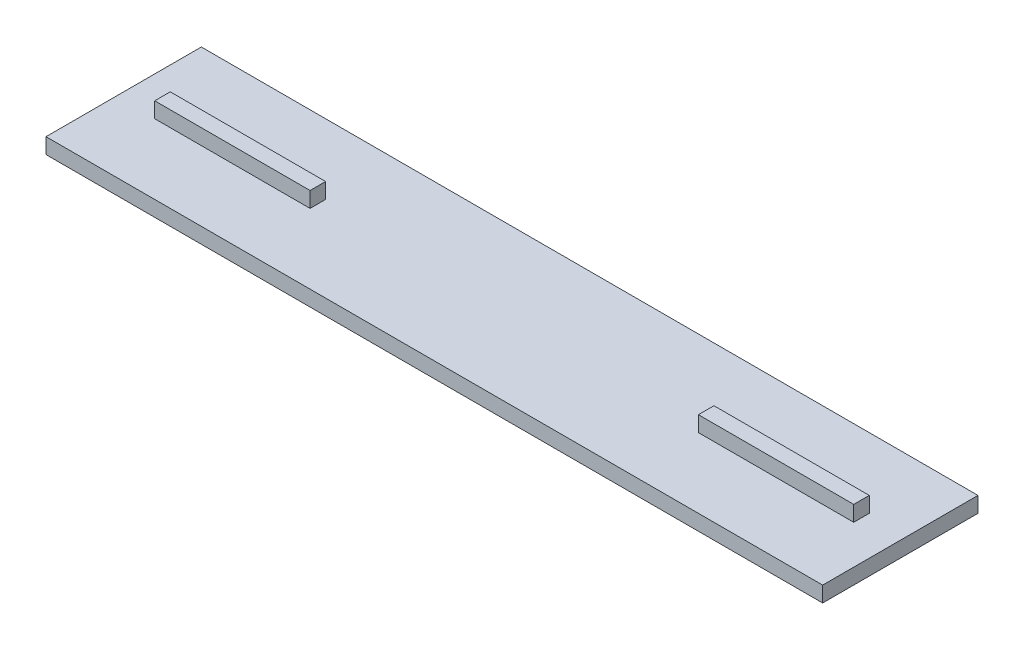
ISO-10303-21;
HEADER;
FILE_DESCRIPTION(('STEP AP214'),'2;1');
FILE_NAME('part.step','',(''),(''),'','','');
FILE_SCHEMA(('AUTOMOTIVE_DESIGN { 1 0 10303 214 1 1 1 1 }'));
ENDSEC;
DATA;
#1=APPLICATION_CONTEXT('core data for automotive mechanical design processes');
#2=APPLICATION_PROTOCOL_DEFINITION('international standard','automotive_design',2000,#1);
#3=PRODUCT_CONTEXT('',#1,'mechanical');
#4=PRODUCT('Part','Part','',(#3));
#5=PRODUCT_RELATED_PRODUCT_CATEGORY('part','',(#4));
#6=PRODUCT_DEFINITION_FORMATION('','',#4);
#7=PRODUCT_DEFINITION_CONTEXT('part definition',#1,'design');
#8=PRODUCT_DEFINITION('design','',#6,#7);
#9=PRODUCT_DEFINITION_SHAPE('','',#8);
#10=(LENGTH_UNIT() NAMED_UNIT(*) SI_UNIT(.MILLI.,.METRE.));
#11=(NAMED_UNIT(*) PLANE_ANGLE_UNIT() SI_UNIT($,.RADIAN.));
#12=(NAMED_UNIT(*) SI_UNIT($,.STERADIAN.) SOLID_ANGLE_UNIT());
#13=UNCERTAINTY_MEASURE_WITH_UNIT(LENGTH_MEASURE(1.E-05),#10,'distance_accuracy_value','');
#14=(GEOMETRIC_REPRESENTATION_CONTEXT(3) GLOBAL_UNCERTAINTY_ASSIGNED_CONTEXT((#13)) GLOBAL_UNIT_ASSIGNED_CONTEXT((#10,
#11,#12)) REPRESENTATION_CONTEXT('',''));
#15=CARTESIAN_POINT('',(0.,0.,0.));
#16=DIRECTION('',(0.,0.,1.));
#17=DIRECTION('',(1.,0.,0.));
#18=AXIS2_PLACEMENT_3D('',#15,#16,#17);
#19=CARTESIAN_POINT('',(0.,2.,0.));
#20=DIRECTION('',(0.,1.,0.));
#21=DIRECTION('',(0.,0.,1.));
#22=AXIS2_PLACEMENT_3D('',#19,#20,#21);
#23=PLANE('',#22);
#24=DIRECTION('',(0.,0.,1.));
#25=VECTOR('',#24,1.);
#26=CARTESIAN_POINT('',(-50.,2.,0.));
#27=LINE('',#26,#25);
#28=CARTESIAN_POINT('',(-50.,2.,0.));
#29=VERTEX_POINT('',#28);
#30=CARTESIAN_POINT('',(-50.,2.,20.));
#31=VERTEX_POINT('',#30);
#32=EDGE_CURVE('E232',#29,#31,#27,.T.);
#33=ORIENTED_EDGE('',*,*,#32,.T.);
#34=DIRECTION('',(1.,0.,0.));
#35=VECTOR('',#34,1.);
#36=CARTESIAN_POINT('',(-50.,2.,20.));
#37=LINE('',#36,#35);
#38=CARTESIAN_POINT('',(50.,2.,20.));
#39=VERTEX_POINT('',#38);
#40=EDGE_CURVE('E236',#31,#39,#37,.T.);
#41=ORIENTED_EDGE('',*,*,#40,.T.);
#42=DIRECTION('',(0.,0.,-1.));
#43=VECTOR('',#42,1.);
#44=CARTESIAN_POINT('',(50.,2.,0.));
#45=LINE('',#44,#43);
#46=CARTESIAN_POINT('',(50.,2.,0.));
#47=VERTEX_POINT('',#46);
#48=EDGE_CURVE('E240',#39,#47,#45,.T.);
#49=ORIENTED_EDGE('',*,*,#48,.T.);
#50=DIRECTION('',(-1.,0.,0.));
#51=VECTOR('',#50,1.);
#52=CARTESIAN_POINT('',(50.,2.,0.));
#53=LINE('',#52,#51);
#54=EDGE_CURVE('E243',#47,#29,#53,.T.);
#55=ORIENTED_EDGE('',*,*,#54,.T.);
#56=EDGE_LOOP('',(#33,#41,#49,#55));
#57=FACE_BOUND('',#56,.T.);
#58=DIRECTION('',(1.,0.,0.));
#59=VECTOR('',#58,1.);
#60=CARTESIAN_POINT('',(0.,2.,9.00000000000001));
#61=LINE('',#60,#59);
#62=CARTESIAN_POINT('',(25.,2.,9.00000000000001));
#63=VERTEX_POINT('',#62);
#64=CARTESIAN_POINT('',(45.,2.,9.00000000000001));
#65=VERTEX_POINT('',#64);
#66=EDGE_CURVE('E210',#63,#65,#61,.T.);
#67=ORIENTED_EDGE('',*,*,#66,.T.);
#68=DIRECTION('',(0.,0.,1.));
#69=VECTOR('',#68,1.);
#70=CARTESIAN_POINT('',(45.,2.,0.));
#71=LINE('',#70,#69);
#72=CARTESIAN_POINT('',(45.,2.,11.));
#73=VERTEX_POINT('',#72);
#74=EDGE_CURVE('E214',#65,#73,#71,.T.);
#75=ORIENTED_EDGE('',*,*,#74,.T.);
#76=DIRECTION('',(-1.,0.,0.));
#77=VECTOR('',#76,1.);
#78=CARTESIAN_POINT('',(0.,2.,11.));
#79=LINE('',#78,#77);
#80=CARTESIAN_POINT('',(25.,2.,11.));
#81=VERTEX_POINT('',#80);
#82=EDGE_CURVE('E157',#73,#81,#79,.T.);
#83=ORIENTED_EDGE('',*,*,#82,.T.);
#84=DIRECTION('',(0.,0.,-1.));
#85=VECTOR('',#84,1.);
#86=CARTESIAN_POINT('',(25.,2.,0.));
#87=LINE('',#86,#85);
#88=EDGE_CURVE('E206',#81,#63,#87,.T.);
#89=ORIENTED_EDGE('',*,*,#88,.T.);
#90=EDGE_LOOP('',(#67,#75,#83,#89));
#91=FACE_BOUND('',#90,.T.);
#92=DIRECTION('',(-1.,0.,0.));
#93=VECTOR('',#92,1.);
#94=CARTESIAN_POINT('',(0.,2.,11.));
#95=LINE('',#94,#93);
#96=CARTESIAN_POINT('',(-25.,2.,11.));
#97=VERTEX_POINT('',#96);
#98=CARTESIAN_POINT('',(-45.,2.,11.));
#99=VERTEX_POINT('',#98);
#100=EDGE_CURVE('E226',#97,#99,#95,.T.);
#101=ORIENTED_EDGE('',*,*,#100,.T.);
#102=DIRECTION('',(0.,0.,-1.));
#103=VECTOR('',#102,1.);
#104=CARTESIAN_POINT('',(-45.,2.,0.));
#105=LINE('',#104,#103);
#106=CARTESIAN_POINT('',(-45.,2.,9.00000000000001));
#107=VERTEX_POINT('',#106);
#108=EDGE_CURVE('E153',#99,#107,#105,.T.);
#109=ORIENTED_EDGE('',*,*,#108,.T.);
#110=DIRECTION('',(1.,0.,0.));
#111=VECTOR('',#110,1.);
#112=CARTESIAN_POINT('',(0.,2.,9.00000000000001));
#113=LINE('',#112,#111);
#114=CARTESIAN_POINT('',(-25.,2.,9.00000000000001));
#115=VERTEX_POINT('',#114);
#116=EDGE_CURVE('E218',#107,#115,#113,.T.);
#117=ORIENTED_EDGE('',*,*,#116,.T.);
#118=DIRECTION('',(0.,0.,1.));
#119=VECTOR('',#118,1.);
#120=CARTESIAN_POINT('',(-25.,2.,0.));
#121=LINE('',#120,#119);
#122=EDGE_CURVE('E222',#115,#97,#121,.T.);
#123=ORIENTED_EDGE('',*,*,#122,.T.);
#124=EDGE_LOOP('',(#101,#109,#117,#123));
#125=FACE_BOUND('',#124,.T.);
#126=ADVANCED_FACE('F45',(#57,#91,#125),#23,.T.);
#127=CARTESIAN_POINT('',(-50.,2.,0.));
#128=DIRECTION('',(1.,0.,0.));
#129=DIRECTION('',(0.,0.,-1.));
#130=AXIS2_PLACEMENT_3D('',#127,#128,#129);
#131=PLANE('',#130);
#132=DIRECTION('',(0.,0.,1.));
#133=VECTOR('',#132,1.);
#134=CARTESIAN_POINT('',(-50.,0.,0.));
#135=LINE('',#134,#133);
#136=CARTESIAN_POINT('',(-50.,0.,0.));
#137=VERTEX_POINT('',#136);
#138=CARTESIAN_POINT('',(-50.,0.,20.));
#139=VERTEX_POINT('',#138);
#140=EDGE_CURVE('E231',#137,#139,#135,.T.);
#141=ORIENTED_EDGE('',*,*,#140,.T.);
#142=DIRECTION('',(0.,-1.,0.));
#143=VECTOR('',#142,1.);
#144=CARTESIAN_POINT('',(-50.,2.,20.));
#145=LINE('',#144,#143);
#146=EDGE_CURVE('E11',#31,#139,#145,.T.);
#147=ORIENTED_EDGE('',*,*,#146,.F.);
#148=ORIENTED_EDGE('',*,*,#32,.F.);
#149=DIRECTION('',(0.,-1.,0.));
#150=VECTOR('',#149,1.);
#151=CARTESIAN_POINT('',(-50.,2.,0.));
#152=LINE('',#151,#150);
#153=EDGE_CURVE('E246',#29,#137,#152,.T.);
#154=ORIENTED_EDGE('',*,*,#153,.T.);
#155=EDGE_LOOP('',(#141,#147,#148,#154));
#156=FACE_BOUND('',#155,.T.);
#157=ADVANCED_FACE('F47',(#156),#131,.F.);
#158=CARTESIAN_POINT('',(-50.,2.,20.));
#159=DIRECTION('',(0.,0.,-1.));
#160=DIRECTION('',(-1.,0.,0.));
#161=AXIS2_PLACEMENT_3D('',#158,#159,#160);
#162=PLANE('',#161);
#163=DIRECTION('',(1.,0.,0.));
#164=VECTOR('',#163,1.);
#165=CARTESIAN_POINT('',(-50.,0.,20.));
#166=LINE('',#165,#164);
#167=CARTESIAN_POINT('',(50.,0.,20.));
#168=VERTEX_POINT('',#167);
#169=EDGE_CURVE('E250',#139,#168,#166,.T.);
#170=ORIENTED_EDGE('',*,*,#169,.T.);
#171=DIRECTION('',(0.,-1.,0.));
#172=VECTOR('',#171,1.);
#173=CARTESIAN_POINT('',(50.,2.,20.));
#174=LINE('',#173,#172);
#175=EDGE_CURVE('E54',#39,#168,#174,.T.);
#176=ORIENTED_EDGE('',*,*,#175,.F.);
#177=ORIENTED_EDGE('',*,*,#40,.F.);
#178=ORIENTED_EDGE('',*,*,#146,.T.);
#179=EDGE_LOOP('',(#170,#176,#177,#178));
#180=FACE_BOUND('',#179,.T.);
#181=ADVANCED_FACE('F286',(#180),#162,.F.);
#182=CARTESIAN_POINT('',(50.,2.,0.));
#183=DIRECTION('',(-1.,0.,0.));
#184=DIRECTION('',(0.,0.,1.));
#185=AXIS2_PLACEMENT_3D('',#182,#183,#184);
#186=PLANE('',#185);
#187=DIRECTION('',(0.,0.,-1.));
#188=VECTOR('',#187,1.);
#189=CARTESIAN_POINT('',(50.,0.,0.));
#190=LINE('',#189,#188);
#191=CARTESIAN_POINT('',(50.,0.,0.));
#192=VERTEX_POINT('',#191);
#193=EDGE_CURVE('E253',#168,#192,#190,.T.);
#194=ORIENTED_EDGE('',*,*,#193,.T.);
#195=DIRECTION('',(0.,-1.,0.));
#196=VECTOR('',#195,1.);
#197=CARTESIAN_POINT('',(50.,2.,0.));
#198=LINE('',#197,#196);
#199=EDGE_CURVE('E261',#47,#192,#198,.T.);
#200=ORIENTED_EDGE('',*,*,#199,.F.);
#201=ORIENTED_EDGE('',*,*,#48,.F.);
#202=ORIENTED_EDGE('',*,*,#175,.T.);
#203=EDGE_LOOP('',(#194,#200,#201,#202));
#204=FACE_BOUND('',#203,.T.);
#205=ADVANCED_FACE('F270',(#204),#186,.F.);
#206=CARTESIAN_POINT('',(50.,2.,0.));
#207=DIRECTION('',(0.,0.,1.));
#208=DIRECTION('',(1.,0.,0.));
#209=AXIS2_PLACEMENT_3D('',#206,#207,#208);
#210=PLANE('',#209);
#211=DIRECTION('',(-1.,0.,0.));
#212=VECTOR('',#211,1.);
#213=CARTESIAN_POINT('',(50.,0.,0.));
#214=LINE('',#213,#212);
#215=EDGE_CURVE('E237',#192,#137,#214,.T.);
#216=ORIENTED_EDGE('',*,*,#215,.T.);
#217=ORIENTED_EDGE('',*,*,#153,.F.);
#218=ORIENTED_EDGE('',*,*,#54,.F.);
#219=ORIENTED_EDGE('',*,*,#199,.T.);
#220=EDGE_LOOP('',(#216,#217,#218,#219));
#221=FACE_BOUND('',#220,.T.);
#222=ADVANCED_FACE('F279',(#221),#210,.F.);
#223=CARTESIAN_POINT('',(0.,0.,0.));
#224=DIRECTION('',(0.,1.,0.));
#225=DIRECTION('',(0.,0.,1.));
#226=AXIS2_PLACEMENT_3D('',#223,#224,#225);
#227=PLANE('',#226);
#228=ORIENTED_EDGE('',*,*,#140,.F.);
#229=ORIENTED_EDGE('',*,*,#215,.F.);
#230=ORIENTED_EDGE('',*,*,#193,.F.);
#231=ORIENTED_EDGE('',*,*,#169,.F.);
#232=EDGE_LOOP('',(#228,#229,#230,#231));
#233=FACE_BOUND('',#232,.T.);
#234=ADVANCED_FACE('F276',(#233),#227,.F.);
#235=CARTESIAN_POINT('',(45.,4.,10.));
#236=DIRECTION('',(-1.,0.,0.));
#237=DIRECTION('',(0.,0.,1.));
#238=AXIS2_PLACEMENT_3D('',#235,#236,#237);
#239=PLANE('',#238);
#240=ORIENTED_EDGE('',*,*,#74,.F.);
#241=DIRECTION('',(0.,-1.,0.));
#242=VECTOR('',#241,1.);
#243=CARTESIAN_POINT('',(45.,4.,9.00000000000001));
#244=LINE('',#243,#242);
#245=CARTESIAN_POINT('',(45.,4.,9.00000000000001));
#246=VERTEX_POINT('',#245);
#247=EDGE_CURVE('E178',#246,#65,#244,.T.);
#248=ORIENTED_EDGE('',*,*,#247,.F.);
#249=DIRECTION('',(0.,0.,-1.));
#250=VECTOR('',#249,1.);
#251=CARTESIAN_POINT('',(45.,4.,10.));
#252=LINE('',#251,#250);
#253=CARTESIAN_POINT('',(45.,4.,11.));
#254=VERTEX_POINT('',#253);
#255=EDGE_CURVE('E147',#254,#246,#252,.T.);
#256=ORIENTED_EDGE('',*,*,#255,.F.);
#257=DIRECTION('',(0.,-1.,0.));
#258=VECTOR('',#257,1.);
#259=CARTESIAN_POINT('',(45.,4.,11.));
#260=LINE('',#259,#258);
#261=EDGE_CURVE('E188',#254,#73,#260,.T.);
#262=ORIENTED_EDGE('',*,*,#261,.T.);
#263=EDGE_LOOP('',(#240,#248,#256,#262));
#264=FACE_BOUND('',#263,.T.);
#265=ADVANCED_FACE('F304',(#264),#239,.F.);
#266=CARTESIAN_POINT('',(45.,4.,9.00000000000001));
#267=DIRECTION('',(0.,0.,1.));
#268=DIRECTION('',(1.,0.,0.));
#269=AXIS2_PLACEMENT_3D('',#266,#267,#268);
#270=PLANE('',#269);
#271=ORIENTED_EDGE('',*,*,#66,.F.);
#272=DIRECTION('',(0.,-1.,0.));
#273=VECTOR('',#272,1.);
#274=CARTESIAN_POINT('',(25.,4.,9.00000000000001));
#275=LINE('',#274,#273);
#276=CARTESIAN_POINT('',(25.,4.,9.00000000000001));
#277=VERTEX_POINT('',#276);
#278=EDGE_CURVE('E182',#277,#63,#275,.T.);
#279=ORIENTED_EDGE('',*,*,#278,.F.);
#280=DIRECTION('',(-1.,0.,0.));
#281=VECTOR('',#280,1.);
#282=CARTESIAN_POINT('',(45.,4.,9.00000000000001));
#283=LINE('',#282,#281);
#284=EDGE_CURVE('E198',#246,#277,#283,.T.);
#285=ORIENTED_EDGE('',*,*,#284,.F.);
#286=ORIENTED_EDGE('',*,*,#247,.T.);
#287=EDGE_LOOP('',(#271,#279,#285,#286));
#288=FACE_BOUND('',#287,.T.);
#289=ADVANCED_FACE('F341',(#288),#270,.F.);
#290=CARTESIAN_POINT('',(25.,4.,9.00000000000001));
#291=DIRECTION('',(1.,0.,0.));
#292=DIRECTION('',(0.,0.,-1.));
#293=AXIS2_PLACEMENT_3D('',#290,#291,#292);
#294=PLANE('',#293);
#295=ORIENTED_EDGE('',*,*,#88,.F.);
#296=DIRECTION('',(0.,-1.,0.));
#297=VECTOR('',#296,1.);
#298=CARTESIAN_POINT('',(25.,4.,11.));
#299=LINE('',#298,#297);
#300=CARTESIAN_POINT('',(25.,4.,11.));
#301=VERTEX_POINT('',#300);
#302=EDGE_CURVE('E69',#301,#81,#299,.T.);
#303=ORIENTED_EDGE('',*,*,#302,.F.);
#304=DIRECTION('',(0.,0.,1.));
#305=VECTOR('',#304,1.);
#306=CARTESIAN_POINT('',(25.,4.,9.00000000000001));
#307=LINE('',#306,#305);
#308=EDGE_CURVE('E195',#277,#301,#307,.T.);
#309=ORIENTED_EDGE('',*,*,#308,.F.);
#310=ORIENTED_EDGE('',*,*,#278,.T.);
#311=EDGE_LOOP('',(#295,#303,#309,#310));
#312=FACE_BOUND('',#311,.T.);
#313=ADVANCED_FACE('F351',(#312),#294,.F.);
#314=CARTESIAN_POINT('',(45.,4.,11.));
#315=DIRECTION('',(0.,0.,-1.));
#316=DIRECTION('',(-1.,0.,0.));
#317=AXIS2_PLACEMENT_3D('',#314,#315,#316);
#318=PLANE('',#317);
#319=ORIENTED_EDGE('',*,*,#82,.F.);
#320=ORIENTED_EDGE('',*,*,#261,.F.);
#321=DIRECTION('',(1.,0.,0.));
#322=VECTOR('',#321,1.);
#323=CARTESIAN_POINT('',(45.,4.,11.));
#324=LINE('',#323,#322);
#325=EDGE_CURVE('E192',#301,#254,#324,.T.);
#326=ORIENTED_EDGE('',*,*,#325,.F.);
#327=ORIENTED_EDGE('',*,*,#302,.T.);
#328=EDGE_LOOP('',(#319,#320,#326,#327));
#329=FACE_BOUND('',#328,.T.);
#330=ADVANCED_FACE('F360',(#329),#318,.F.);
#331=CARTESIAN_POINT('',(0.,4.,0.));
#332=DIRECTION('',(0.,-1.,0.));
#333=DIRECTION('',(0.,0.,-1.));
#334=AXIS2_PLACEMENT_3D('',#331,#332,#333);
#335=PLANE('',#334);
#336=ORIENTED_EDGE('',*,*,#255,.T.);
#337=ORIENTED_EDGE('',*,*,#284,.T.);
#338=ORIENTED_EDGE('',*,*,#308,.T.);
#339=ORIENTED_EDGE('',*,*,#325,.T.);
#340=EDGE_LOOP('',(#336,#337,#338,#339));
#341=FACE_BOUND('',#340,.T.);
#342=ADVANCED_FACE('F301',(#341),#335,.F.);
#343=CARTESIAN_POINT('',(-45.,4.,10.));
#344=DIRECTION('',(1.,0.,0.));
#345=DIRECTION('',(0.,0.,-1.));
#346=AXIS2_PLACEMENT_3D('',#343,#344,#345);
#347=PLANE('',#346);
#348=ORIENTED_EDGE('',*,*,#108,.F.);
#349=DIRECTION('',(0.,-1.,0.));
#350=VECTOR('',#349,1.);
#351=CARTESIAN_POINT('',(-45.,4.,11.));
#352=LINE('',#351,#350);
#353=CARTESIAN_POINT('',(-45.,4.,11.));
#354=VERTEX_POINT('',#353);
#355=EDGE_CURVE('E150',#354,#99,#352,.T.);
#356=ORIENTED_EDGE('',*,*,#355,.F.);
#357=DIRECTION('',(0.,0.,1.));
#358=VECTOR('',#357,1.);
#359=CARTESIAN_POINT('',(-45.,4.,10.));
#360=LINE('',#359,#358);
#361=CARTESIAN_POINT('',(-45.,4.,9.00000000000001));
#362=VERTEX_POINT('',#361);
#363=EDGE_CURVE('E136',#362,#354,#360,.T.);
#364=ORIENTED_EDGE('',*,*,#363,.F.);
#365=DIRECTION('',(0.,-1.,0.));
#366=VECTOR('',#365,1.);
#367=CARTESIAN_POINT('',(-45.,4.,9.00000000000001));
#368=LINE('',#367,#366);
#369=EDGE_CURVE('E171',#362,#107,#368,.T.);
#370=ORIENTED_EDGE('',*,*,#369,.T.);
#371=EDGE_LOOP('',(#348,#356,#364,#370));
#372=FACE_BOUND('',#371,.T.);
#373=ADVANCED_FACE('F151',(#372),#347,.F.);
#374=CARTESIAN_POINT('',(-45.,4.,11.));
#375=DIRECTION('',(0.,0.,-1.));
#376=DIRECTION('',(-1.,0.,0.));
#377=AXIS2_PLACEMENT_3D('',#374,#375,#376);
#378=PLANE('',#377);
#379=ORIENTED_EDGE('',*,*,#100,.F.);
#380=DIRECTION('',(0.,-1.,0.));
#381=VECTOR('',#380,1.);
#382=CARTESIAN_POINT('',(-25.,4.,11.));
#383=LINE('',#382,#381);
#384=CARTESIAN_POINT('',(-25.,4.,11.));
#385=VERTEX_POINT('',#384);
#386=EDGE_CURVE('E158',#385,#97,#383,.T.);
#387=ORIENTED_EDGE('',*,*,#386,.F.);
#388=DIRECTION('',(1.,0.,0.));
#389=VECTOR('',#388,1.);
#390=CARTESIAN_POINT('',(-45.,4.,11.));
#391=LINE('',#390,#389);
#392=EDGE_CURVE('E140',#354,#385,#391,.T.);
#393=ORIENTED_EDGE('',*,*,#392,.F.);
#394=ORIENTED_EDGE('',*,*,#355,.T.);
#395=EDGE_LOOP('',(#379,#387,#393,#394));
#396=FACE_BOUND('',#395,.T.);
#397=ADVANCED_FACE('F160',(#396),#378,.F.);
#398=CARTESIAN_POINT('',(-25.,4.,9.00000000000001));
#399=DIRECTION('',(-1.,0.,0.));
#400=DIRECTION('',(0.,0.,1.));
#401=AXIS2_PLACEMENT_3D('',#398,#399,#400);
#402=PLANE('',#401);
#403=ORIENTED_EDGE('',*,*,#122,.F.);
#404=DIRECTION('',(0.,-1.,0.));
#405=VECTOR('',#404,1.);
#406=CARTESIAN_POINT('',(-25.,4.,9.00000000000001));
#407=LINE('',#406,#405);
#408=CARTESIAN_POINT('',(-25.,4.,9.00000000000001));
#409=VERTEX_POINT('',#408);
#410=EDGE_CURVE('E61',#409,#115,#407,.T.);
#411=ORIENTED_EDGE('',*,*,#410,.F.);
#412=DIRECTION('',(0.,0.,-1.));
#413=VECTOR('',#412,1.);
#414=CARTESIAN_POINT('',(-25.,4.,9.00000000000001));
#415=LINE('',#414,#413);
#416=EDGE_CURVE('E164',#385,#409,#415,.T.);
#417=ORIENTED_EDGE('',*,*,#416,.F.);
#418=ORIENTED_EDGE('',*,*,#386,.T.);
#419=EDGE_LOOP('',(#403,#411,#417,#418));
#420=FACE_BOUND('',#419,.T.);
#421=ADVANCED_FACE('F390',(#420),#402,.F.);
#422=CARTESIAN_POINT('',(-45.,4.,9.00000000000001));
#423=DIRECTION('',(0.,0.,1.));
#424=DIRECTION('',(1.,0.,0.));
#425=AXIS2_PLACEMENT_3D('',#422,#423,#424);
#426=PLANE('',#425);
#427=ORIENTED_EDGE('',*,*,#116,.F.);
#428=ORIENTED_EDGE('',*,*,#369,.F.);
#429=DIRECTION('',(-1.,0.,0.));
#430=VECTOR('',#429,1.);
#431=CARTESIAN_POINT('',(-45.,4.,9.00000000000001));
#432=LINE('',#431,#430);
#433=EDGE_CURVE('E142',#409,#362,#432,.T.);
#434=ORIENTED_EDGE('',*,*,#433,.F.);
#435=ORIENTED_EDGE('',*,*,#410,.T.);
#436=EDGE_LOOP('',(#427,#428,#434,#435));
#437=FACE_BOUND('',#436,.T.);
#438=ADVANCED_FACE('F398',(#437),#426,.F.);
#439=CARTESIAN_POINT('',(0.,4.,0.));
#440=DIRECTION('',(0.,-1.,0.));
#441=DIRECTION('',(0.,0.,-1.));
#442=AXIS2_PLACEMENT_3D('',#439,#440,#441);
#443=PLANE('',#442);
#444=ORIENTED_EDGE('',*,*,#363,.T.);
#445=ORIENTED_EDGE('',*,*,#392,.T.);
#446=ORIENTED_EDGE('',*,*,#416,.T.);
#447=ORIENTED_EDGE('',*,*,#433,.T.);
#448=EDGE_LOOP('',(#444,#445,#446,#447));
#449=FACE_BOUND('',#448,.T.);
#450=ADVANCED_FACE('F138',(#449),#443,.F.);
#451=CLOSED_SHELL('',(#126,#157,#181,#205,#222,#234,#265,#289,#313,#330,#342,#373,#397,#421,
#438,#450));
#452=MANIFOLD_SOLID_BREP('B2',#451);
#453=ADVANCED_BREP_SHAPE_REPRESENTATION('',(#18,#452),#14);
#454=SHAPE_DEFINITION_REPRESENTATION(#9,#453);
ENDSEC;
END-ISO-10303-21;
